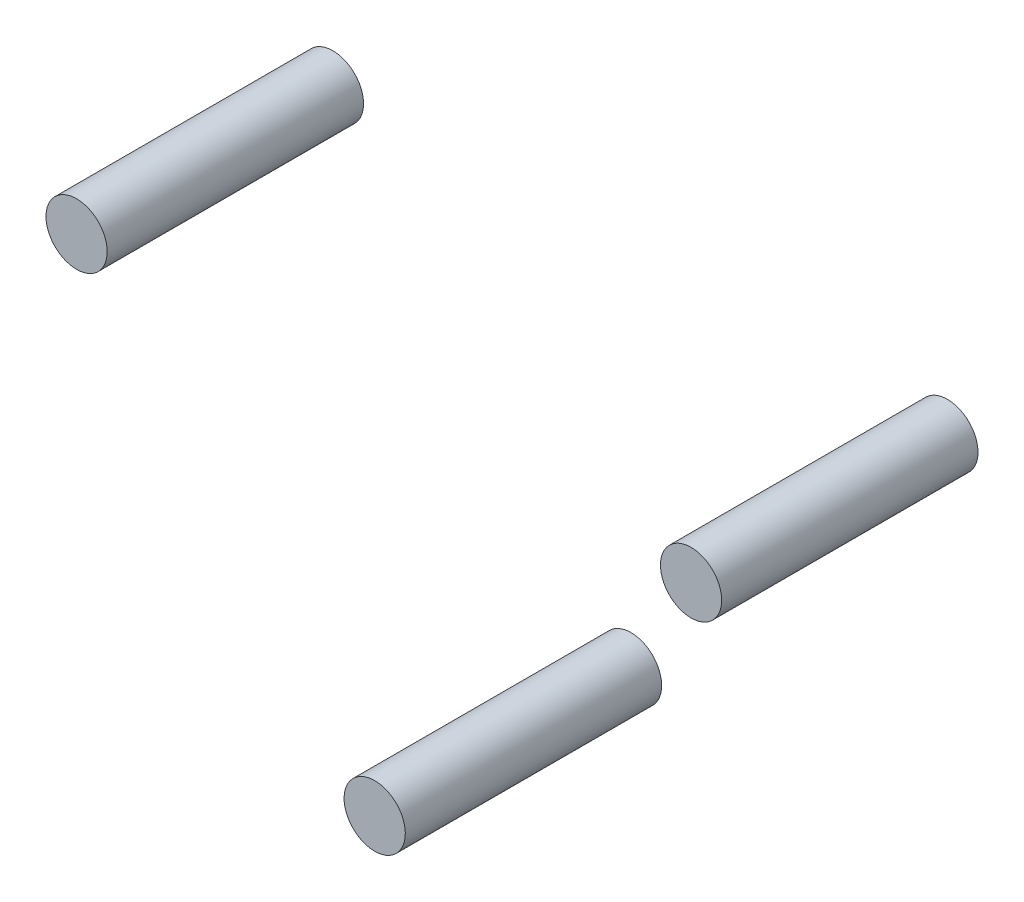
ISO-10303-21;
HEADER;
FILE_DESCRIPTION(('STEP AP214'),'2;1');
FILE_NAME('part.step','',(''),(''),'','','');
FILE_SCHEMA(('AUTOMOTIVE_DESIGN { 1 0 10303 214 1 1 1 1 }'));
ENDSEC;
DATA;
#1=APPLICATION_CONTEXT('core data for automotive mechanical design processes');
#2=APPLICATION_PROTOCOL_DEFINITION('international standard','automotive_design',2000,#1);
#3=PRODUCT_CONTEXT('',#1,'mechanical');
#4=PRODUCT('Part','Part','',(#3));
#5=PRODUCT_RELATED_PRODUCT_CATEGORY('part','',(#4));
#6=PRODUCT_DEFINITION_FORMATION('','',#4);
#7=PRODUCT_DEFINITION_CONTEXT('part definition',#1,'design');
#8=PRODUCT_DEFINITION('design','',#6,#7);
#9=PRODUCT_DEFINITION_SHAPE('','',#8);
#10=(LENGTH_UNIT() NAMED_UNIT(*) SI_UNIT(.MILLI.,.METRE.));
#11=(NAMED_UNIT(*) PLANE_ANGLE_UNIT() SI_UNIT($,.RADIAN.));
#12=(NAMED_UNIT(*) SI_UNIT($,.STERADIAN.) SOLID_ANGLE_UNIT());
#13=UNCERTAINTY_MEASURE_WITH_UNIT(LENGTH_MEASURE(1.E-05),#10,'distance_accuracy_value','');
#14=(GEOMETRIC_REPRESENTATION_CONTEXT(3) GLOBAL_UNCERTAINTY_ASSIGNED_CONTEXT((#13)) GLOBAL_UNIT_ASSIGNED_CONTEXT((#10,
#11,#12)) REPRESENTATION_CONTEXT('',''));
#15=CARTESIAN_POINT('',(0.,0.,0.));
#16=DIRECTION('',(0.,0.,1.));
#17=DIRECTION('',(1.,0.,0.));
#18=AXIS2_PLACEMENT_3D('',#15,#16,#17);
#19=CARTESIAN_POINT('',(12.1300055128516,4.85155324200131,2.43574999999992));
#20=DIRECTION('',(0.,0.,-1.));
#21=DIRECTION('',(0.,1.,0.));
#22=AXIS2_PLACEMENT_3D('',#19,#20,#21);
#23=PLANE('',#22);
#24=CARTESIAN_POINT('',(13.5146244470044,11.2038780453458,2.43574999999994));
#25=DIRECTION('',(0.,0.,1.));
#26=DIRECTION('',(0.,-1.,0.));
#27=AXIS2_PLACEMENT_3D('',#24,#25,#26);
#28=CIRCLE('',#27,0.25);
#29=CARTESIAN_POINT('',(13.5146244470044,10.9538780453458,2.43574999999994));
#30=VERTEX_POINT('',#29);
#31=EDGE_CURVE('P0_E18',#30,#30,#28,.T.);
#32=ORIENTED_EDGE('',*,*,#31,.F.);
#33=EDGE_LOOP('',(#32));
#34=FACE_BOUND('',#33,.T.);
#35=ADVANCED_FACE('P0_F15',(#34),#23,.T.);
#36=CARTESIAN_POINT('',(12.1300055128516,4.8515532420013,4.53002499999991));
#37=DIRECTION('',(0.,0.,-1.));
#38=DIRECTION('',(0.,1.,0.));
#39=AXIS2_PLACEMENT_3D('',#36,#37,#38);
#40=PLANE('',#39);
#41=CARTESIAN_POINT('',(13.5146244470044,11.2038780453458,4.53002499999993));
#42=DIRECTION('',(0.,0.,1.));
#43=DIRECTION('',(0.,-1.,0.));
#44=AXIS2_PLACEMENT_3D('',#41,#42,#43);
#45=CIRCLE('',#44,0.25);
#46=CARTESIAN_POINT('',(13.5146244470044,10.9538780453458,4.53002499999993));
#47=VERTEX_POINT('',#46);
#48=EDGE_CURVE('P0_E10',#47,#47,#45,.F.);
#49=ORIENTED_EDGE('',*,*,#48,.F.);
#50=EDGE_LOOP('',(#49));
#51=FACE_BOUND('',#50,.T.);
#52=ADVANCED_FACE('P0_F30',(#51),#40,.F.);
#53=CARTESIAN_POINT('',(13.5146244470044,11.2038780453458,3.18002499999993));
#54=DIRECTION('',(0.,0.,1.));
#55=DIRECTION('',(0.,-1.,0.));
#56=AXIS2_PLACEMENT_3D('',#53,#54,#55);
#57=CYLINDRICAL_SURFACE('',#56,0.25);
#58=ORIENTED_EDGE('',*,*,#31,.T.);
#59=EDGE_LOOP('',(#58));
#60=FACE_BOUND('',#59,.T.);
#61=ORIENTED_EDGE('',*,*,#48,.T.);
#62=EDGE_LOOP('',(#61));
#63=FACE_BOUND('',#62,.T.);
#64=ADVANCED_FACE('P0_F27',(#60,#63),#57,.T.);
#65=CLOSED_SHELL('',(#35,#52,#64));
#66=MANIFOLD_SOLID_BREP('P0_B1',#65);
#67=CARTESIAN_POINT('',(12.1300055128516,4.8515532420013,4.53002499999991));
#68=DIRECTION('',(0.,0.,-1.));
#69=DIRECTION('',(0.,1.,0.));
#70=AXIS2_PLACEMENT_3D('',#67,#68,#69);
#71=PLANE('',#70);
#72=CARTESIAN_POINT('',(18.5344333007865,11.2476852535476,4.53002499999993));
#73=DIRECTION('',(0.,0.,1.));
#74=DIRECTION('',(0.,-1.,0.));
#75=AXIS2_PLACEMENT_3D('',#72,#73,#74);
#76=CIRCLE('',#75,0.25);
#77=CARTESIAN_POINT('',(18.5344333007865,10.9976852535476,4.53002499999993));
#78=VERTEX_POINT('',#77);
#79=EDGE_CURVE('P1_E18',#78,#78,#76,.F.);
#80=ORIENTED_EDGE('',*,*,#79,.F.);
#81=EDGE_LOOP('',(#80));
#82=FACE_BOUND('',#81,.T.);
#83=ADVANCED_FACE('P1_F15',(#82),#71,.F.);
#84=CARTESIAN_POINT('',(12.1300055128516,4.85155324200131,2.43574999999992));
#85=DIRECTION('',(0.,0.,-1.));
#86=DIRECTION('',(0.,1.,0.));
#87=AXIS2_PLACEMENT_3D('',#84,#85,#86);
#88=PLANE('',#87);
#89=CARTESIAN_POINT('',(18.5344333007865,11.2476852535476,2.43574999999994));
#90=DIRECTION('',(0.,0.,1.));
#91=DIRECTION('',(0.,-1.,0.));
#92=AXIS2_PLACEMENT_3D('',#89,#90,#91);
#93=CIRCLE('',#92,0.25);
#94=CARTESIAN_POINT('',(18.5344333007865,10.9976852535476,2.43574999999994));
#95=VERTEX_POINT('',#94);
#96=EDGE_CURVE('P1_E10',#95,#95,#93,.T.);
#97=ORIENTED_EDGE('',*,*,#96,.F.);
#98=EDGE_LOOP('',(#97));
#99=FACE_BOUND('',#98,.T.);
#100=ADVANCED_FACE('P1_F30',(#99),#88,.T.);
#101=CARTESIAN_POINT('',(18.5344333007865,11.2476852535476,3.18002499999993));
#102=DIRECTION('',(0.,0.,1.));
#103=DIRECTION('',(0.,-1.,0.));
#104=AXIS2_PLACEMENT_3D('',#101,#102,#103);
#105=CYLINDRICAL_SURFACE('',#104,0.25);
#106=ORIENTED_EDGE('',*,*,#79,.T.);
#107=EDGE_LOOP('',(#106));
#108=FACE_BOUND('',#107,.T.);
#109=ORIENTED_EDGE('',*,*,#96,.T.);
#110=EDGE_LOOP('',(#109));
#111=FACE_BOUND('',#110,.T.);
#112=ADVANCED_FACE('P1_F27',(#108,#111),#105,.T.);
#113=CLOSED_SHELL('',(#83,#100,#112));
#114=MANIFOLD_SOLID_BREP('P1_B1',#113);
#115=CARTESIAN_POINT('',(12.1300055128516,4.8515532420013,4.53002499999991));
#116=DIRECTION('',(0.,0.,-1.));
#117=DIRECTION('',(0.,1.,0.));
#118=AXIS2_PLACEMENT_3D('',#115,#116,#117);
#119=PLANE('',#118);
#120=CARTESIAN_POINT('',(15.9500141652443,8.3050201805495,4.53002499999992));
#121=DIRECTION('',(0.,0.,1.));
#122=DIRECTION('',(0.,-1.,0.));
#123=AXIS2_PLACEMENT_3D('',#120,#121,#122);
#124=CIRCLE('',#123,0.25);
#125=CARTESIAN_POINT('',(15.9500141652443,8.0550201805495,4.53002499999992));
#126=VERTEX_POINT('',#125);
#127=EDGE_CURVE('P2_E18',#126,#126,#124,.F.);
#128=ORIENTED_EDGE('',*,*,#127,.F.);
#129=EDGE_LOOP('',(#128));
#130=FACE_BOUND('',#129,.T.);
#131=ADVANCED_FACE('P2_F15',(#130),#119,.F.);
#132=CARTESIAN_POINT('',(12.1300055128516,4.85155324200131,2.43574999999992));
#133=DIRECTION('',(0.,0.,-1.));
#134=DIRECTION('',(0.,1.,0.));
#135=AXIS2_PLACEMENT_3D('',#132,#133,#134);
#136=PLANE('',#135);
#137=CARTESIAN_POINT('',(15.9500141652443,8.30502018054951,2.43574999999993));
#138=DIRECTION('',(0.,0.,1.));
#139=DIRECTION('',(0.,-1.,0.));
#140=AXIS2_PLACEMENT_3D('',#137,#138,#139);
#141=CIRCLE('',#140,0.25);
#142=CARTESIAN_POINT('',(15.9500141652443,8.05502018054951,2.43574999999993));
#143=VERTEX_POINT('',#142);
#144=EDGE_CURVE('P2_E10',#143,#143,#141,.T.);
#145=ORIENTED_EDGE('',*,*,#144,.F.);
#146=EDGE_LOOP('',(#145));
#147=FACE_BOUND('',#146,.T.);
#148=ADVANCED_FACE('P2_F30',(#147),#136,.T.);
#149=CARTESIAN_POINT('',(15.9500141652443,8.30502018054951,3.18002499999992));
#150=DIRECTION('',(0.,0.,1.));
#151=DIRECTION('',(0.,-1.,0.));
#152=AXIS2_PLACEMENT_3D('',#149,#150,#151);
#153=CYLINDRICAL_SURFACE('',#152,0.25);
#154=ORIENTED_EDGE('',*,*,#127,.T.);
#155=EDGE_LOOP('',(#154));
#156=FACE_BOUND('',#155,.T.);
#157=ORIENTED_EDGE('',*,*,#144,.T.);
#158=EDGE_LOOP('',(#157));
#159=FACE_BOUND('',#158,.T.);
#160=ADVANCED_FACE('P2_F27',(#156,#159),#153,.T.);
#161=CLOSED_SHELL('',(#131,#148,#160));
#162=MANIFOLD_SOLID_BREP('P2_B1',#161);
#163=ADVANCED_BREP_SHAPE_REPRESENTATION('',(#18,#66,#114,#162),#14);
#164=SHAPE_DEFINITION_REPRESENTATION(#9,#163);
ENDSEC;
END-ISO-10303-21;
